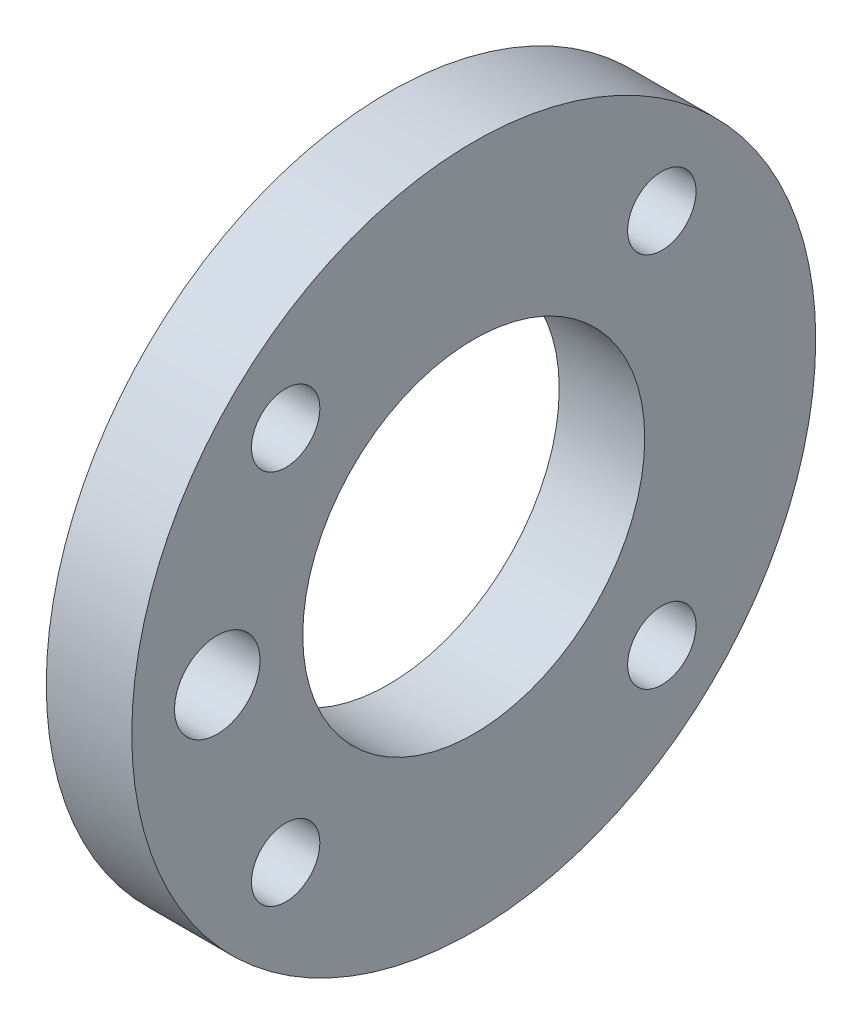
ISO-10303-21;
HEADER;
FILE_DESCRIPTION(('STEP AP214'),'2;1');
FILE_NAME('part.step','',(''),(''),'','','');
FILE_SCHEMA(('AUTOMOTIVE_DESIGN { 1 0 10303 214 1 1 1 1 }'));
ENDSEC;
DATA;
#1=APPLICATION_CONTEXT('core data for automotive mechanical design processes');
#2=APPLICATION_PROTOCOL_DEFINITION('international standard','automotive_design',2000,#1);
#3=PRODUCT_CONTEXT('',#1,'mechanical');
#4=PRODUCT('Part','Part','',(#3));
#5=PRODUCT_RELATED_PRODUCT_CATEGORY('part','',(#4));
#6=PRODUCT_DEFINITION_FORMATION('','',#4);
#7=PRODUCT_DEFINITION_CONTEXT('part definition',#1,'design');
#8=PRODUCT_DEFINITION('design','',#6,#7);
#9=PRODUCT_DEFINITION_SHAPE('','',#8);
#10=(LENGTH_UNIT() NAMED_UNIT(*) SI_UNIT(.MILLI.,.METRE.));
#11=(NAMED_UNIT(*) PLANE_ANGLE_UNIT() SI_UNIT($,.RADIAN.));
#12=(NAMED_UNIT(*) SI_UNIT($,.STERADIAN.) SOLID_ANGLE_UNIT());
#13=UNCERTAINTY_MEASURE_WITH_UNIT(LENGTH_MEASURE(1.E-05),#10,'distance_accuracy_value','');
#14=(GEOMETRIC_REPRESENTATION_CONTEXT(3) GLOBAL_UNCERTAINTY_ASSIGNED_CONTEXT((#13)) GLOBAL_UNIT_ASSIGNED_CONTEXT((#10,
#11,#12)) REPRESENTATION_CONTEXT('',''));
#15=CARTESIAN_POINT('',(0.,0.,0.));
#16=DIRECTION('',(0.,0.,1.));
#17=DIRECTION('',(1.,0.,0.));
#18=AXIS2_PLACEMENT_3D('',#15,#16,#17);
#19=CARTESIAN_POINT('',(5.,0.,0.));
#20=DIRECTION('',(1.,0.,0.));
#21=DIRECTION('',(0.,0.,-1.));
#22=AXIS2_PLACEMENT_3D('',#19,#20,#21);
#23=PLANE('',#22);
#24=CARTESIAN_POINT('',(5.,-11.,-11.0000000000002));
#25=DIRECTION('',(1.,0.,0.));
#26=DIRECTION('',(0.,0.,-1.));
#27=AXIS2_PLACEMENT_3D('',#24,#25,#26);
#28=CIRCLE('',#27,2.);
#29=CARTESIAN_POINT('',(5.,-11.,-13.0000000000002));
#30=VERTEX_POINT('',#29);
#31=EDGE_CURVE('E64',#30,#30,#28,.T.);
#32=ORIENTED_EDGE('',*,*,#31,.F.);
#33=EDGE_LOOP('',(#32));
#34=FACE_BOUND('',#33,.T.);
#35=CARTESIAN_POINT('',(5.,0.,15.));
#36=DIRECTION('',(1.,0.,0.));
#37=DIRECTION('',(0.,0.,-1.));
#38=AXIS2_PLACEMENT_3D('',#35,#36,#37);
#39=CIRCLE('',#38,2.5);
#40=CARTESIAN_POINT('',(5.,0.,12.5));
#41=VERTEX_POINT('',#40);
#42=EDGE_CURVE('E52',#41,#41,#39,.T.);
#43=ORIENTED_EDGE('',*,*,#42,.F.);
#44=EDGE_LOOP('',(#43));
#45=FACE_BOUND('',#44,.T.);
#46=CARTESIAN_POINT('',(5.,0.,0.));
#47=DIRECTION('',(1.,0.,0.));
#48=DIRECTION('',(0.,0.,-1.));
#49=AXIS2_PLACEMENT_3D('',#46,#47,#48);
#50=CIRCLE('',#49,10.);
#51=CARTESIAN_POINT('',(5.,0.,-10.));
#52=VERTEX_POINT('',#51);
#53=EDGE_CURVE('E41',#52,#52,#50,.T.);
#54=ORIENTED_EDGE('',*,*,#53,.F.);
#55=EDGE_LOOP('',(#54));
#56=FACE_BOUND('',#55,.T.);
#57=CARTESIAN_POINT('',(5.,0.,0.));
#58=DIRECTION('',(1.,0.,0.));
#59=DIRECTION('',(0.,0.,-1.));
#60=AXIS2_PLACEMENT_3D('',#57,#58,#59);
#61=CIRCLE('',#60,20.);
#62=CARTESIAN_POINT('',(5.,0.,-20.));
#63=VERTEX_POINT('',#62);
#64=EDGE_CURVE('E10',#63,#63,#61,.T.);
#65=ORIENTED_EDGE('',*,*,#64,.T.);
#66=EDGE_LOOP('',(#65));
#67=FACE_BOUND('',#66,.T.);
#68=CARTESIAN_POINT('',(5.,11.,11.));
#69=DIRECTION('',(1.,0.,0.));
#70=DIRECTION('',(0.,0.,-1.));
#71=AXIS2_PLACEMENT_3D('',#68,#69,#70);
#72=CIRCLE('',#71,2.);
#73=CARTESIAN_POINT('',(5.,11.,9.));
#74=VERTEX_POINT('',#73);
#75=EDGE_CURVE('E46',#74,#74,#72,.T.);
#76=ORIENTED_EDGE('',*,*,#75,.F.);
#77=EDGE_LOOP('',(#76));
#78=FACE_BOUND('',#77,.T.);
#79=CARTESIAN_POINT('',(5.,11.,-11.));
#80=DIRECTION('',(1.,0.,0.));
#81=DIRECTION('',(0.,0.,-1.));
#82=AXIS2_PLACEMENT_3D('',#79,#80,#81);
#83=CIRCLE('',#82,2.);
#84=CARTESIAN_POINT('',(5.,11.,-13.));
#85=VERTEX_POINT('',#84);
#86=EDGE_CURVE('E58',#85,#85,#83,.T.);
#87=ORIENTED_EDGE('',*,*,#86,.F.);
#88=EDGE_LOOP('',(#87));
#89=FACE_BOUND('',#88,.T.);
#90=CARTESIAN_POINT('',(5.,-11.,10.9999999999998));
#91=DIRECTION('',(1.,0.,0.));
#92=DIRECTION('',(0.,0.,-1.));
#93=AXIS2_PLACEMENT_3D('',#90,#91,#92);
#94=CIRCLE('',#93,2.);
#95=CARTESIAN_POINT('',(5.,-11.,8.99999999999977));
#96=VERTEX_POINT('',#95);
#97=EDGE_CURVE('E70',#96,#96,#94,.T.);
#98=ORIENTED_EDGE('',*,*,#97,.F.);
#99=EDGE_LOOP('',(#98));
#100=FACE_BOUND('',#99,.T.);
#101=ADVANCED_FACE('F30',(#34,#45,#56,#67,#78,#89,#100),#23,.T.);
#102=CARTESIAN_POINT('',(0.,0.,0.));
#103=DIRECTION('',(1.,0.,0.));
#104=DIRECTION('',(0.,0.,-1.));
#105=AXIS2_PLACEMENT_3D('',#102,#103,#104);
#106=PLANE('',#105);
#107=CARTESIAN_POINT('',(0.,0.,0.));
#108=DIRECTION('',(1.,0.,0.));
#109=DIRECTION('',(0.,0.,-1.));
#110=AXIS2_PLACEMENT_3D('',#107,#108,#109);
#111=CIRCLE('',#110,20.);
#112=CARTESIAN_POINT('',(0.,0.,-20.));
#113=VERTEX_POINT('',#112);
#114=EDGE_CURVE('E34',#113,#113,#111,.T.);
#115=ORIENTED_EDGE('',*,*,#114,.F.);
#116=EDGE_LOOP('',(#115));
#117=FACE_BOUND('',#116,.T.);
#118=CARTESIAN_POINT('',(0.,0.,0.));
#119=DIRECTION('',(1.,0.,0.));
#120=DIRECTION('',(0.,0.,-1.));
#121=AXIS2_PLACEMENT_3D('',#118,#119,#120);
#122=CIRCLE('',#121,10.);
#123=CARTESIAN_POINT('',(0.,0.,-10.));
#124=VERTEX_POINT('',#123);
#125=EDGE_CURVE('E43',#124,#124,#122,.T.);
#126=ORIENTED_EDGE('',*,*,#125,.T.);
#127=EDGE_LOOP('',(#126));
#128=FACE_BOUND('',#127,.T.);
#129=CARTESIAN_POINT('',(0.,11.,11.));
#130=DIRECTION('',(1.,0.,0.));
#131=DIRECTION('',(0.,0.,-1.));
#132=AXIS2_PLACEMENT_3D('',#129,#130,#131);
#133=CIRCLE('',#132,2.);
#134=CARTESIAN_POINT('',(0.,11.,9.));
#135=VERTEX_POINT('',#134);
#136=EDGE_CURVE('E49',#135,#135,#133,.T.);
#137=ORIENTED_EDGE('',*,*,#136,.T.);
#138=EDGE_LOOP('',(#137));
#139=FACE_BOUND('',#138,.T.);
#140=CARTESIAN_POINT('',(0.,0.,15.));
#141=DIRECTION('',(1.,0.,0.));
#142=DIRECTION('',(0.,0.,-1.));
#143=AXIS2_PLACEMENT_3D('',#140,#141,#142);
#144=CIRCLE('',#143,2.5);
#145=CARTESIAN_POINT('',(0.,0.,12.5));
#146=VERTEX_POINT('',#145);
#147=EDGE_CURVE('E55',#146,#146,#144,.T.);
#148=ORIENTED_EDGE('',*,*,#147,.T.);
#149=EDGE_LOOP('',(#148));
#150=FACE_BOUND('',#149,.T.);
#151=CARTESIAN_POINT('',(0.,11.,-11.));
#152=DIRECTION('',(1.,0.,0.));
#153=DIRECTION('',(0.,0.,-1.));
#154=AXIS2_PLACEMENT_3D('',#151,#152,#153);
#155=CIRCLE('',#154,2.);
#156=CARTESIAN_POINT('',(0.,11.,-13.));
#157=VERTEX_POINT('',#156);
#158=EDGE_CURVE('E61',#157,#157,#155,.T.);
#159=ORIENTED_EDGE('',*,*,#158,.T.);
#160=EDGE_LOOP('',(#159));
#161=FACE_BOUND('',#160,.T.);
#162=CARTESIAN_POINT('',(0.,-11.,-11.0000000000002));
#163=DIRECTION('',(1.,0.,0.));
#164=DIRECTION('',(0.,0.,-1.));
#165=AXIS2_PLACEMENT_3D('',#162,#163,#164);
#166=CIRCLE('',#165,2.);
#167=CARTESIAN_POINT('',(0.,-11.,-13.0000000000002));
#168=VERTEX_POINT('',#167);
#169=EDGE_CURVE('E67',#168,#168,#166,.T.);
#170=ORIENTED_EDGE('',*,*,#169,.T.);
#171=EDGE_LOOP('',(#170));
#172=FACE_BOUND('',#171,.T.);
#173=CARTESIAN_POINT('',(0.,-11.,10.9999999999998));
#174=DIRECTION('',(1.,0.,0.));
#175=DIRECTION('',(0.,0.,-1.));
#176=AXIS2_PLACEMENT_3D('',#173,#174,#175);
#177=CIRCLE('',#176,2.);
#178=CARTESIAN_POINT('',(0.,-11.,8.99999999999977));
#179=VERTEX_POINT('',#178);
#180=EDGE_CURVE('E73',#179,#179,#177,.T.);
#181=ORIENTED_EDGE('',*,*,#180,.T.);
#182=EDGE_LOOP('',(#181));
#183=FACE_BOUND('',#182,.T.);
#184=ADVANCED_FACE('F83',(#117,#128,#139,#150,#161,#172,#183),#106,.F.);
#185=CARTESIAN_POINT('',(5.,0.,0.));
#186=DIRECTION('',(-1.,0.,0.));
#187=DIRECTION('',(0.,0.,1.));
#188=AXIS2_PLACEMENT_3D('',#185,#186,#187);
#189=CYLINDRICAL_SURFACE('',#188,20.);
#190=ORIENTED_EDGE('',*,*,#64,.F.);
#191=EDGE_LOOP('',(#190));
#192=FACE_BOUND('',#191,.T.);
#193=ORIENTED_EDGE('',*,*,#114,.T.);
#194=EDGE_LOOP('',(#193));
#195=FACE_BOUND('',#194,.T.);
#196=ADVANCED_FACE('F32',(#192,#195),#189,.T.);
#197=CARTESIAN_POINT('',(5.,0.,0.));
#198=DIRECTION('',(-1.,0.,0.));
#199=DIRECTION('',(0.,0.,1.));
#200=AXIS2_PLACEMENT_3D('',#197,#198,#199);
#201=CYLINDRICAL_SURFACE('',#200,10.);
#202=ORIENTED_EDGE('',*,*,#53,.T.);
#203=EDGE_LOOP('',(#202));
#204=FACE_BOUND('',#203,.T.);
#205=ORIENTED_EDGE('',*,*,#125,.F.);
#206=EDGE_LOOP('',(#205));
#207=FACE_BOUND('',#206,.T.);
#208=ADVANCED_FACE('F93',(#204,#207),#201,.F.);
#209=CARTESIAN_POINT('',(5.,11.,11.));
#210=DIRECTION('',(-1.,0.,0.));
#211=DIRECTION('',(0.,0.,1.));
#212=AXIS2_PLACEMENT_3D('',#209,#210,#211);
#213=CYLINDRICAL_SURFACE('',#212,2.);
#214=ORIENTED_EDGE('',*,*,#75,.T.);
#215=EDGE_LOOP('',(#214));
#216=FACE_BOUND('',#215,.T.);
#217=ORIENTED_EDGE('',*,*,#136,.F.);
#218=EDGE_LOOP('',(#217));
#219=FACE_BOUND('',#218,.T.);
#220=ADVANCED_FACE('F96',(#216,#219),#213,.F.);
#221=CARTESIAN_POINT('',(5.,0.,15.));
#222=DIRECTION('',(-1.,0.,0.));
#223=DIRECTION('',(0.,0.,1.));
#224=AXIS2_PLACEMENT_3D('',#221,#222,#223);
#225=CYLINDRICAL_SURFACE('',#224,2.5);
#226=ORIENTED_EDGE('',*,*,#42,.T.);
#227=EDGE_LOOP('',(#226));
#228=FACE_BOUND('',#227,.T.);
#229=ORIENTED_EDGE('',*,*,#147,.F.);
#230=EDGE_LOOP('',(#229));
#231=FACE_BOUND('',#230,.T.);
#232=ADVANCED_FACE('F100',(#228,#231),#225,.F.);
#233=CARTESIAN_POINT('',(5.,11.,-11.));
#234=DIRECTION('',(-1.,0.,0.));
#235=DIRECTION('',(0.,0.,1.));
#236=AXIS2_PLACEMENT_3D('',#233,#234,#235);
#237=CYLINDRICAL_SURFACE('',#236,2.);
#238=ORIENTED_EDGE('',*,*,#86,.T.);
#239=EDGE_LOOP('',(#238));
#240=FACE_BOUND('',#239,.T.);
#241=ORIENTED_EDGE('',*,*,#158,.F.);
#242=EDGE_LOOP('',(#241));
#243=FACE_BOUND('',#242,.T.);
#244=ADVANCED_FACE('F104',(#240,#243),#237,.F.);
#245=CARTESIAN_POINT('',(5.,-11.,-11.0000000000002));
#246=DIRECTION('',(-1.,0.,0.));
#247=DIRECTION('',(0.,0.,1.));
#248=AXIS2_PLACEMENT_3D('',#245,#246,#247);
#249=CYLINDRICAL_SURFACE('',#248,2.);
#250=ORIENTED_EDGE('',*,*,#31,.T.);
#251=EDGE_LOOP('',(#250));
#252=FACE_BOUND('',#251,.T.);
#253=ORIENTED_EDGE('',*,*,#169,.F.);
#254=EDGE_LOOP('',(#253));
#255=FACE_BOUND('',#254,.T.);
#256=ADVANCED_FACE('F108',(#252,#255),#249,.F.);
#257=CARTESIAN_POINT('',(5.,-11.,10.9999999999998));
#258=DIRECTION('',(-1.,0.,0.));
#259=DIRECTION('',(0.,0.,1.));
#260=AXIS2_PLACEMENT_3D('',#257,#258,#259);
#261=CYLINDRICAL_SURFACE('',#260,2.);
#262=ORIENTED_EDGE('',*,*,#97,.T.);
#263=EDGE_LOOP('',(#262));
#264=FACE_BOUND('',#263,.T.);
#265=ORIENTED_EDGE('',*,*,#180,.F.);
#266=EDGE_LOOP('',(#265));
#267=FACE_BOUND('',#266,.T.);
#268=ADVANCED_FACE('F79',(#264,#267),#261,.F.);
#269=CLOSED_SHELL('',(#101,#184,#196,#208,#220,#232,#244,#256,#268));
#270=MANIFOLD_SOLID_BREP('B2',#269);
#271=ADVANCED_BREP_SHAPE_REPRESENTATION('',(#18,#270),#14);
#272=SHAPE_DEFINITION_REPRESENTATION(#9,#271);
ENDSEC;
END-ISO-10303-21;
